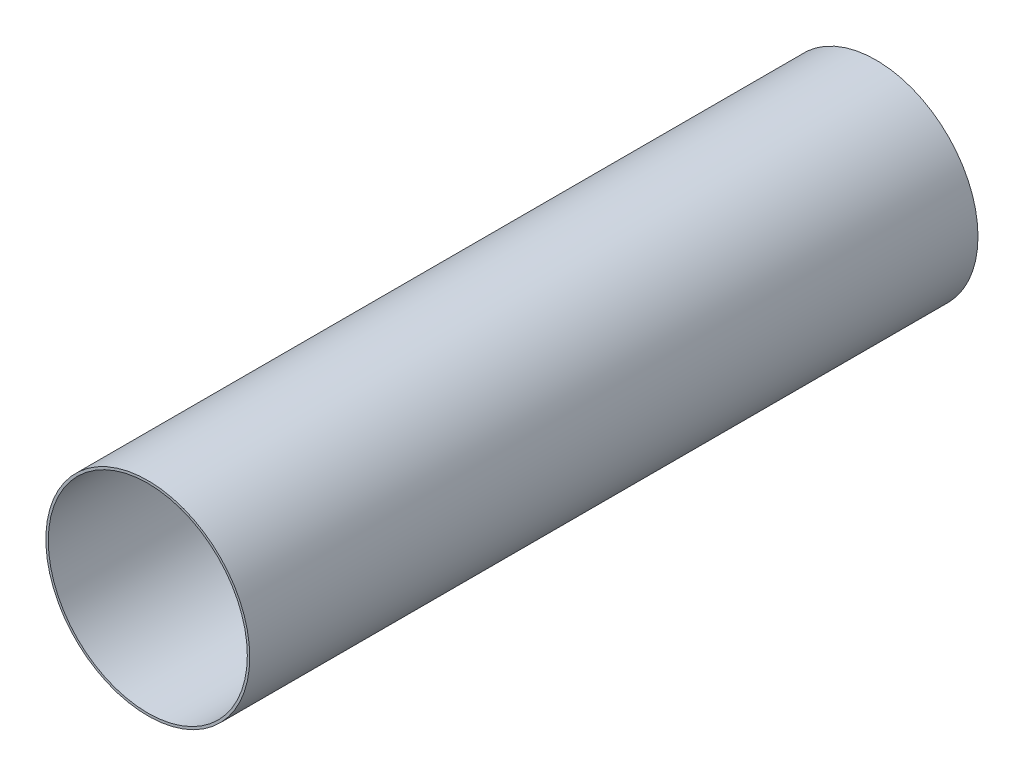
ISO-10303-21;
HEADER;
FILE_DESCRIPTION(('STEP AP214'),'2;1');
FILE_NAME('part.step','',(''),(''),'','','');
FILE_SCHEMA(('AUTOMOTIVE_DESIGN { 1 0 10303 214 1 1 1 1 }'));
ENDSEC;
DATA;
#1=APPLICATION_CONTEXT('core data for automotive mechanical design processes');
#2=APPLICATION_PROTOCOL_DEFINITION('international standard','automotive_design',2000,#1);
#3=PRODUCT_CONTEXT('',#1,'mechanical');
#4=PRODUCT('Part','Part','',(#3));
#5=PRODUCT_RELATED_PRODUCT_CATEGORY('part','',(#4));
#6=PRODUCT_DEFINITION_FORMATION('','',#4);
#7=PRODUCT_DEFINITION_CONTEXT('part definition',#1,'design');
#8=PRODUCT_DEFINITION('design','',#6,#7);
#9=PRODUCT_DEFINITION_SHAPE('','',#8);
#10=(LENGTH_UNIT() NAMED_UNIT(*) SI_UNIT(.MILLI.,.METRE.));
#11=(NAMED_UNIT(*) PLANE_ANGLE_UNIT() SI_UNIT($,.RADIAN.));
#12=(NAMED_UNIT(*) SI_UNIT($,.STERADIAN.) SOLID_ANGLE_UNIT());
#13=UNCERTAINTY_MEASURE_WITH_UNIT(LENGTH_MEASURE(1.E-05),#10,'distance_accuracy_value','');
#14=(GEOMETRIC_REPRESENTATION_CONTEXT(3) GLOBAL_UNCERTAINTY_ASSIGNED_CONTEXT((#13)) GLOBAL_UNIT_ASSIGNED_CONTEXT((#10,
#11,#12)) REPRESENTATION_CONTEXT('',''));
#15=CARTESIAN_POINT('',(0.,0.,0.));
#16=DIRECTION('',(0.,0.,1.));
#17=DIRECTION('',(1.,0.,0.));
#18=AXIS2_PLACEMENT_3D('',#15,#16,#17);
#19=CARTESIAN_POINT('',(0.,0.,15.));
#20=DIRECTION('',(0.,0.,-1.));
#21=DIRECTION('',(-1.,0.,0.));
#22=AXIS2_PLACEMENT_3D('',#19,#20,#21);
#23=CYLINDRICAL_SURFACE('',#22,2.05);
#24=CARTESIAN_POINT('',(0.,0.,15.));
#25=DIRECTION('',(0.,0.,1.));
#26=DIRECTION('',(1.,0.,0.));
#27=AXIS2_PLACEMENT_3D('',#24,#25,#26);
#28=CIRCLE('',#27,2.05);
#29=CARTESIAN_POINT('',(2.05,0.,15.));
#30=VERTEX_POINT('',#29);
#31=EDGE_CURVE('E40',#30,#30,#28,.T.);
#32=ORIENTED_EDGE('',*,*,#31,.T.);
#33=EDGE_LOOP('',(#32));
#34=FACE_BOUND('',#33,.T.);
#35=CARTESIAN_POINT('',(0.,0.,0.));
#36=DIRECTION('',(0.,0.,1.));
#37=DIRECTION('',(1.,0.,0.));
#38=AXIS2_PLACEMENT_3D('',#35,#36,#37);
#39=CIRCLE('',#38,2.05);
#40=CARTESIAN_POINT('',(2.05,0.,0.));
#41=VERTEX_POINT('',#40);
#42=EDGE_CURVE('E46',#41,#41,#39,.T.);
#43=ORIENTED_EDGE('',*,*,#42,.F.);
#44=EDGE_LOOP('',(#43));
#45=FACE_BOUND('',#44,.T.);
#46=ADVANCED_FACE('F33',(#34,#45),#23,.F.);
#47=CARTESIAN_POINT('',(0.,0.,15.));
#48=DIRECTION('',(0.,0.,-1.));
#49=DIRECTION('',(-1.,0.,0.));
#50=AXIS2_PLACEMENT_3D('',#47,#48,#49);
#51=CYLINDRICAL_SURFACE('',#50,2.1);
#52=CARTESIAN_POINT('',(0.,0.,15.));
#53=DIRECTION('',(0.,0.,1.));
#54=DIRECTION('',(1.,0.,0.));
#55=AXIS2_PLACEMENT_3D('',#52,#53,#54);
#56=CIRCLE('',#55,2.1);
#57=CARTESIAN_POINT('',(2.1,0.,15.));
#58=VERTEX_POINT('',#57);
#59=EDGE_CURVE('E10',#58,#58,#56,.T.);
#60=ORIENTED_EDGE('',*,*,#59,.F.);
#61=EDGE_LOOP('',(#60));
#62=FACE_BOUND('',#61,.T.);
#63=CARTESIAN_POINT('',(0.,0.,0.));
#64=DIRECTION('',(0.,0.,1.));
#65=DIRECTION('',(1.,0.,0.));
#66=AXIS2_PLACEMENT_3D('',#63,#64,#65);
#67=CIRCLE('',#66,2.1);
#68=CARTESIAN_POINT('',(2.1,0.,0.));
#69=VERTEX_POINT('',#68);
#70=EDGE_CURVE('E36',#69,#69,#67,.T.);
#71=ORIENTED_EDGE('',*,*,#70,.T.);
#72=EDGE_LOOP('',(#71));
#73=FACE_BOUND('',#72,.T.);
#74=ADVANCED_FACE('F53',(#62,#73),#51,.T.);
#75=CARTESIAN_POINT('',(0.,0.,15.));
#76=DIRECTION('',(0.,0.,1.));
#77=DIRECTION('',(1.,0.,0.));
#78=AXIS2_PLACEMENT_3D('',#75,#76,#77);
#79=PLANE('',#78);
#80=ORIENTED_EDGE('',*,*,#31,.F.);
#81=EDGE_LOOP('',(#80));
#82=FACE_BOUND('',#81,.T.);
#83=ORIENTED_EDGE('',*,*,#59,.T.);
#84=EDGE_LOOP('',(#83));
#85=FACE_BOUND('',#84,.T.);
#86=ADVANCED_FACE('F57',(#82,#85),#79,.T.);
#87=CARTESIAN_POINT('',(0.,0.,0.));
#88=DIRECTION('',(0.,0.,1.));
#89=DIRECTION('',(1.,0.,0.));
#90=AXIS2_PLACEMENT_3D('',#87,#88,#89);
#91=PLANE('',#90);
#92=ORIENTED_EDGE('',*,*,#42,.T.);
#93=EDGE_LOOP('',(#92));
#94=FACE_BOUND('',#93,.T.);
#95=ORIENTED_EDGE('',*,*,#70,.F.);
#96=EDGE_LOOP('',(#95));
#97=FACE_BOUND('',#96,.T.);
#98=ADVANCED_FACE('F55',(#94,#97),#91,.F.);
#99=CLOSED_SHELL('',(#46,#74,#86,#98));
#100=MANIFOLD_SOLID_BREP('B2',#99);
#101=ADVANCED_BREP_SHAPE_REPRESENTATION('',(#18,#100),#14);
#102=SHAPE_DEFINITION_REPRESENTATION(#9,#101);
ENDSEC;
END-ISO-10303-21;
